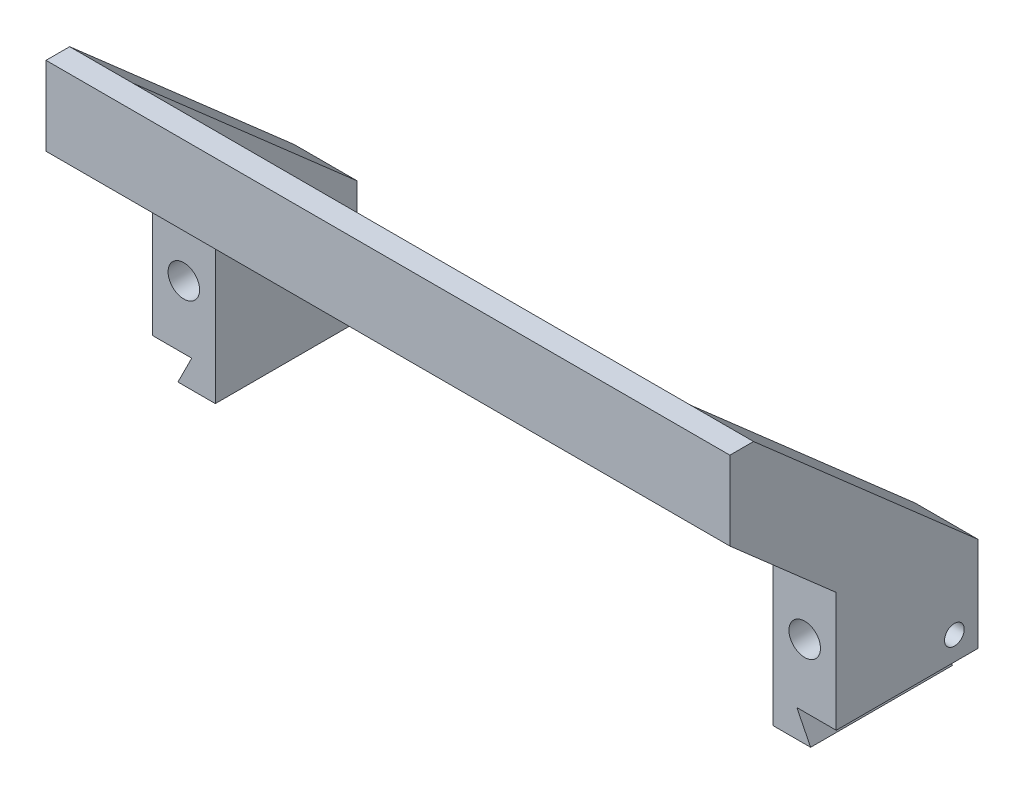
ISO-10303-21;
HEADER;
FILE_DESCRIPTION(('STEP AP214'),'2;1');
FILE_NAME('part.step','',(''),(''),'','','');
FILE_SCHEMA(('AUTOMOTIVE_DESIGN { 1 0 10303 214 1 1 1 1 }'));
ENDSEC;
DATA;
#1=APPLICATION_CONTEXT('core data for automotive mechanical design processes');
#2=APPLICATION_PROTOCOL_DEFINITION('international standard','automotive_design',2000,#1);
#3=PRODUCT_CONTEXT('',#1,'mechanical');
#4=PRODUCT('Part','Part','',(#3));
#5=PRODUCT_RELATED_PRODUCT_CATEGORY('part','',(#4));
#6=PRODUCT_DEFINITION_FORMATION('','',#4);
#7=PRODUCT_DEFINITION_CONTEXT('part definition',#1,'design');
#8=PRODUCT_DEFINITION('design','',#6,#7);
#9=PRODUCT_DEFINITION_SHAPE('','',#8);
#10=(LENGTH_UNIT() NAMED_UNIT(*) SI_UNIT(.MILLI.,.METRE.));
#11=(NAMED_UNIT(*) PLANE_ANGLE_UNIT() SI_UNIT($,.RADIAN.));
#12=(NAMED_UNIT(*) SI_UNIT($,.STERADIAN.) SOLID_ANGLE_UNIT());
#13=UNCERTAINTY_MEASURE_WITH_UNIT(LENGTH_MEASURE(1.E-05),#10,'distance_accuracy_value','');
#14=(GEOMETRIC_REPRESENTATION_CONTEXT(3) GLOBAL_UNCERTAINTY_ASSIGNED_CONTEXT((#13)) GLOBAL_UNIT_ASSIGNED_CONTEXT((#10,
#11,#12)) REPRESENTATION_CONTEXT('',''));
#15=CARTESIAN_POINT('',(0.,0.,0.));
#16=DIRECTION('',(0.,0.,1.));
#17=DIRECTION('',(1.,0.,0.));
#18=AXIS2_PLACEMENT_3D('',#15,#16,#17);
#19=CARTESIAN_POINT('',(-78.83,19.1578947368421,18.));
#20=DIRECTION('',(0.,0.,1.));
#21=DIRECTION('',(0.,-1.,0.));
#22=AXIS2_PLACEMENT_3D('',#19,#20,#21);
#23=PLANE('',#22);
#24=DIRECTION('',(-1.,0.,0.));
#25=VECTOR('',#24,1.);
#26=CARTESIAN_POINT('',(-78.83,0.5,18.));
#27=LINE('',#26,#25);
#28=CARTESIAN_POINT('',(-70.83,0.5,18.));
#29=VERTEX_POINT('',#28);
#30=CARTESIAN_POINT('',(-75.58,0.499999999999995,18.));
#31=VERTEX_POINT('',#30);
#32=EDGE_CURVE('E47',#29,#31,#27,.T.);
#33=ORIENTED_EDGE('',*,*,#32,.F.);
#34=DIRECTION('',(0.,-1.,0.));
#35=VECTOR('',#34,1.);
#36=CARTESIAN_POINT('',(-70.83,19.1578947368421,18.));
#37=LINE('',#36,#35);
#38=CARTESIAN_POINT('',(-70.83,19.1578947368421,18.));
#39=VERTEX_POINT('',#38);
#40=EDGE_CURVE('E171',#39,#29,#37,.T.);
#41=ORIENTED_EDGE('',*,*,#40,.F.);
#42=DIRECTION('',(1.,0.,0.));
#43=VECTOR('',#42,1.);
#44=CARTESIAN_POINT('',(-78.83,19.1578947368421,18.));
#45=LINE('',#44,#43);
#46=CARTESIAN_POINT('',(-78.83,19.1578947368421,18.));
#47=VERTEX_POINT('',#46);
#48=EDGE_CURVE('E196',#47,#39,#45,.T.);
#49=ORIENTED_EDGE('',*,*,#48,.F.);
#50=DIRECTION('',(0.,-1.,0.));
#51=VECTOR('',#50,1.);
#52=CARTESIAN_POINT('',(-78.83,19.1578947368421,18.));
#53=LINE('',#52,#51);
#54=CARTESIAN_POINT('',(-78.83,4.,18.));
#55=VERTEX_POINT('',#54);
#56=EDGE_CURVE('E178',#47,#55,#53,.T.);
#57=ORIENTED_EDGE('',*,*,#56,.T.);
#58=DIRECTION('',(1.,0.,0.));
#59=VECTOR('',#58,1.);
#60=CARTESIAN_POINT('',(-78.83,4.,18.));
#61=LINE('',#60,#59);
#62=CARTESIAN_POINT('',(-73.83,4.,18.));
#63=VERTEX_POINT('',#62);
#64=EDGE_CURVE('E334',#55,#63,#61,.T.);
#65=ORIENTED_EDGE('',*,*,#64,.T.);
#66=DIRECTION('',(-0.447213595499958,-0.894427190999916,0.));
#67=VECTOR('',#66,1.);
#68=CARTESIAN_POINT('',(-68.7668421052632,14.1263157894737,18.));
#69=LINE('',#68,#67);
#70=EDGE_CURVE('E337',#63,#31,#69,.T.);
#71=ORIENTED_EDGE('',*,*,#70,.T.);
#72=EDGE_LOOP('',(#33,#41,#49,#57,#65,#71));
#73=FACE_BOUND('',#72,.T.);
#74=CARTESIAN_POINT('',(-74.83,12.,18.));
#75=DIRECTION('',(0.,0.,1.));
#76=DIRECTION('',(1.,0.,0.));
#77=AXIS2_PLACEMENT_3D('',#74,#75,#76);
#78=CIRCLE('',#77,2.);
#79=CARTESIAN_POINT('',(-72.83,12.,18.));
#80=VERTEX_POINT('',#79);
#81=EDGE_CURVE('E308',#80,#80,#78,.T.);
#82=ORIENTED_EDGE('',*,*,#81,.F.);
#83=EDGE_LOOP('',(#82));
#84=FACE_BOUND('',#83,.T.);
#85=ADVANCED_FACE('F33',(#73,#84),#23,.T.);
#86=CARTESIAN_POINT('',(-78.83,0.,0.));
#87=DIRECTION('',(0.,0.,-1.));
#88=DIRECTION('',(-1.,0.,0.));
#89=AXIS2_PLACEMENT_3D('',#86,#87,#88);
#90=PLANE('',#89);
#91=DIRECTION('',(1.,0.,0.));
#92=VECTOR('',#91,1.);
#93=CARTESIAN_POINT('',(-70.83,0.5,0.));
#94=LINE('',#93,#92);
#95=CARTESIAN_POINT('',(-75.58,0.5,0.));
#96=VERTEX_POINT('',#95);
#97=CARTESIAN_POINT('',(-70.83,0.5,0.));
#98=VERTEX_POINT('',#97);
#99=EDGE_CURVE('E155',#96,#98,#94,.T.);
#100=ORIENTED_EDGE('',*,*,#99,.F.);
#101=DIRECTION('',(0.447213595499958,0.894427190999916,0.));
#102=VECTOR('',#101,1.);
#103=CARTESIAN_POINT('',(-75.83,0.,0.));
#104=LINE('',#103,#102);
#105=CARTESIAN_POINT('',(-73.83,4.,0.));
#106=VERTEX_POINT('',#105);
#107=EDGE_CURVE('E329',#96,#106,#104,.T.);
#108=ORIENTED_EDGE('',*,*,#107,.T.);
#109=DIRECTION('',(-1.,0.,0.));
#110=VECTOR('',#109,1.);
#111=CARTESIAN_POINT('',(-73.83,4.,0.));
#112=LINE('',#111,#110);
#113=CARTESIAN_POINT('',(-78.83,4.,0.));
#114=VERTEX_POINT('',#113);
#115=EDGE_CURVE('E281',#106,#114,#112,.T.);
#116=ORIENTED_EDGE('',*,*,#115,.T.);
#117=DIRECTION('',(0.,1.,0.));
#118=VECTOR('',#117,1.);
#119=CARTESIAN_POINT('',(-78.83,0.,0.));
#120=LINE('',#119,#118);
#121=CARTESIAN_POINT('',(-78.83,16.,0.));
#122=VERTEX_POINT('',#121);
#123=EDGE_CURVE('E190',#114,#122,#120,.T.);
#124=ORIENTED_EDGE('',*,*,#123,.T.);
#125=DIRECTION('',(1.,0.,0.));
#126=VECTOR('',#125,1.);
#127=CARTESIAN_POINT('',(-78.83,16.,0.));
#128=LINE('',#127,#126);
#129=CARTESIAN_POINT('',(-70.83,16.,0.));
#130=VERTEX_POINT('',#129);
#131=EDGE_CURVE('E176',#122,#130,#128,.T.);
#132=ORIENTED_EDGE('',*,*,#131,.T.);
#133=DIRECTION('',(0.,1.,0.));
#134=VECTOR('',#133,1.);
#135=CARTESIAN_POINT('',(-70.83,0.,0.));
#136=LINE('',#135,#134);
#137=EDGE_CURVE('E167',#98,#130,#136,.T.);
#138=ORIENTED_EDGE('',*,*,#137,.F.);
#139=EDGE_LOOP('',(#100,#108,#116,#124,#132,#138));
#140=FACE_BOUND('',#139,.T.);
#141=CARTESIAN_POINT('',(-74.83,12.,0.));
#142=DIRECTION('',(0.,0.,1.));
#143=DIRECTION('',(1.,0.,0.));
#144=AXIS2_PLACEMENT_3D('',#141,#142,#143);
#145=CIRCLE('',#144,2.);
#146=CARTESIAN_POINT('',(-72.83,12.,0.));
#147=VERTEX_POINT('',#146);
#148=EDGE_CURVE('E312',#147,#147,#145,.T.);
#149=ORIENTED_EDGE('',*,*,#148,.T.);
#150=EDGE_LOOP('',(#149));
#151=FACE_BOUND('',#150,.T.);
#152=ADVANCED_FACE('F173',(#140,#151),#90,.T.);
#153=CARTESIAN_POINT('',(-78.83,0.,0.));
#154=DIRECTION('',(-1.,0.,0.));
#155=DIRECTION('',(0.,0.,-1.));
#156=AXIS2_PLACEMENT_3D('',#153,#154,#155);
#157=PLANE('',#156);
#158=CARTESIAN_POINT('',(-78.83,7.,3.));
#159=DIRECTION('',(-1.,0.,0.));
#160=DIRECTION('',(0.,0.,1.));
#161=AXIS2_PLACEMENT_3D('',#158,#159,#160);
#162=CIRCLE('',#161,1.24999999999999);
#163=CARTESIAN_POINT('',(-78.83,7.,4.24999999999999));
#164=VERTEX_POINT('',#163);
#165=EDGE_CURVE('E282',#164,#164,#162,.T.);
#166=ORIENTED_EDGE('',*,*,#165,.F.);
#167=EDGE_LOOP('',(#166));
#168=FACE_BOUND('',#167,.T.);
#169=ORIENTED_EDGE('',*,*,#123,.F.);
#170=DIRECTION('',(0.,0.,1.));
#171=VECTOR('',#170,1.);
#172=CARTESIAN_POINT('',(-78.83,4.,0.));
#173=LINE('',#172,#171);
#174=EDGE_CURVE('E276',#114,#55,#173,.T.);
#175=ORIENTED_EDGE('',*,*,#174,.T.);
#176=ORIENTED_EDGE('',*,*,#56,.F.);
#177=DIRECTION('',(0.,-0.659437818308136,-0.751759112871275));
#178=VECTOR('',#177,1.);
#179=CARTESIAN_POINT('',(-78.83,19.1578947368421,18.));
#180=LINE('',#179,#178);
#181=CARTESIAN_POINT('',(-78.83,31.,31.5));
#182=VERTEX_POINT('',#181);
#183=EDGE_CURVE('E182',#182,#47,#180,.T.);
#184=ORIENTED_EDGE('',*,*,#183,.F.);
#185=DIRECTION('',(0.,-1.,0.));
#186=VECTOR('',#185,1.);
#187=CARTESIAN_POINT('',(-78.83,31.,31.5));
#188=LINE('',#187,#186);
#189=CARTESIAN_POINT('',(-78.83,41.,31.5));
#190=VERTEX_POINT('',#189);
#191=EDGE_CURVE('E342',#190,#182,#188,.T.);
#192=ORIENTED_EDGE('',*,*,#191,.F.);
#193=DIRECTION('',(0.,0.,1.));
#194=VECTOR('',#193,1.);
#195=CARTESIAN_POINT('',(-78.83,41.,31.5));
#196=LINE('',#195,#194);
#197=CARTESIAN_POINT('',(-78.83,41.,28.5));
#198=VERTEX_POINT('',#197);
#199=EDGE_CURVE('E345',#198,#190,#196,.T.);
#200=ORIENTED_EDGE('',*,*,#199,.F.);
#201=DIRECTION('',(0.,0.659437818308136,0.751759112871275));
#202=VECTOR('',#201,1.);
#203=CARTESIAN_POINT('',(-78.83,41.,28.5));
#204=LINE('',#203,#202);
#205=EDGE_CURVE('E348',#122,#198,#204,.T.);
#206=ORIENTED_EDGE('',*,*,#205,.F.);
#207=EDGE_LOOP('',(#169,#175,#176,#184,#192,#200,#206));
#208=FACE_BOUND('',#207,.T.);
#209=ADVANCED_FACE('F370',(#168,#208),#157,.T.);
#210=CARTESIAN_POINT('',(0.,0.,0.));
#211=DIRECTION('',(1.,0.,0.));
#212=DIRECTION('',(0.,0.,-1.));
#213=AXIS2_PLACEMENT_3D('',#210,#211,#212);
#214=PLANE('',#213);
#215=CARTESIAN_POINT('',(0.,7.,3.));
#216=DIRECTION('',(1.,0.,0.));
#217=DIRECTION('',(0.,0.,-1.));
#218=AXIS2_PLACEMENT_3D('',#215,#216,#217);
#219=CIRCLE('',#218,1.24999999999999);
#220=CARTESIAN_POINT('',(0.,7.,1.75000000000001));
#221=VERTEX_POINT('',#220);
#222=EDGE_CURVE('E222',#221,#221,#219,.T.);
#223=ORIENTED_EDGE('',*,*,#222,.T.);
#224=EDGE_LOOP('',(#223));
#225=FACE_BOUND('',#224,.T.);
#226=DIRECTION('',(0.,1.,0.));
#227=VECTOR('',#226,1.);
#228=CARTESIAN_POINT('',(0.,0.,0.));
#229=LINE('',#228,#227);
#230=CARTESIAN_POINT('',(0.,0.5,0.));
#231=VERTEX_POINT('',#230);
#232=CARTESIAN_POINT('',(0.,16.,0.));
#233=VERTEX_POINT('',#232);
#234=EDGE_CURVE('E235',#231,#233,#229,.T.);
#235=ORIENTED_EDGE('',*,*,#234,.F.);
#236=DIRECTION('',(0.,0.,-1.));
#237=VECTOR('',#236,1.);
#238=CARTESIAN_POINT('',(0.,0.5,31.5));
#239=LINE('',#238,#237);
#240=CARTESIAN_POINT('',(0.,0.5,18.));
#241=VERTEX_POINT('',#240);
#242=EDGE_CURVE('E309',#241,#231,#239,.T.);
#243=ORIENTED_EDGE('',*,*,#242,.F.);
#244=DIRECTION('',(0.,-1.,0.));
#245=VECTOR('',#244,1.);
#246=CARTESIAN_POINT('',(0.,19.1578947368421,18.));
#247=LINE('',#246,#245);
#248=CARTESIAN_POINT('',(0.,19.1578947368421,18.));
#249=VERTEX_POINT('',#248);
#250=EDGE_CURVE('E239',#249,#241,#247,.T.);
#251=ORIENTED_EDGE('',*,*,#250,.F.);
#252=DIRECTION('',(0.,-0.659437818308136,-0.751759112871275));
#253=VECTOR('',#252,1.);
#254=CARTESIAN_POINT('',(0.,19.1578947368421,18.));
#255=LINE('',#254,#253);
#256=CARTESIAN_POINT('',(0.,31.,31.5));
#257=VERTEX_POINT('',#256);
#258=EDGE_CURVE('E255',#257,#249,#255,.T.);
#259=ORIENTED_EDGE('',*,*,#258,.F.);
#260=DIRECTION('',(0.,0.,1.));
#261=VECTOR('',#260,1.);
#262=CARTESIAN_POINT('',(0.,31.,28.5));
#263=LINE('',#262,#261);
#264=CARTESIAN_POINT('',(0.,31.,28.5));
#265=VERTEX_POINT('',#264);
#266=EDGE_CURVE('E207',#265,#257,#263,.T.);
#267=ORIENTED_EDGE('',*,*,#266,.F.);
#268=DIRECTION('',(0.,-1.,0.));
#269=VECTOR('',#268,1.);
#270=CARTESIAN_POINT('',(0.,41.,28.5));
#271=LINE('',#270,#269);
#272=CARTESIAN_POINT('',(0.,41.,28.5));
#273=VERTEX_POINT('',#272);
#274=EDGE_CURVE('E204',#273,#265,#271,.T.);
#275=ORIENTED_EDGE('',*,*,#274,.F.);
#276=DIRECTION('',(0.,0.659437818308136,0.751759112871275));
#277=VECTOR('',#276,1.);
#278=CARTESIAN_POINT('',(0.,41.,28.5));
#279=LINE('',#278,#277);
#280=EDGE_CURVE('E252',#233,#273,#279,.T.);
#281=ORIENTED_EDGE('',*,*,#280,.F.);
#282=EDGE_LOOP('',(#235,#243,#251,#259,#267,#275,#281));
#283=FACE_BOUND('',#282,.T.);
#284=ADVANCED_FACE('F394',(#225,#283),#214,.F.);
#285=CARTESIAN_POINT('',(8.,0.,0.));
#286=DIRECTION('',(0.,0.,1.));
#287=DIRECTION('',(1.,0.,0.));
#288=AXIS2_PLACEMENT_3D('',#285,#286,#287);
#289=PLANE('',#288);
#290=CARTESIAN_POINT('',(4.,12.,0.));
#291=DIRECTION('',(0.,0.,1.));
#292=DIRECTION('',(1.,0.,0.));
#293=AXIS2_PLACEMENT_3D('',#290,#291,#292);
#294=CIRCLE('',#293,2.);
#295=CARTESIAN_POINT('',(6.,12.,0.));
#296=VERTEX_POINT('',#295);
#297=EDGE_CURVE('E320',#296,#296,#294,.T.);
#298=ORIENTED_EDGE('',*,*,#297,.T.);
#299=EDGE_LOOP('',(#298));
#300=FACE_BOUND('',#299,.T.);
#301=DIRECTION('',(-0.447213595499958,0.894427190999916,0.));
#302=VECTOR('',#301,1.);
#303=CARTESIAN_POINT('',(5.,0.,0.));
#304=LINE('',#303,#302);
#305=CARTESIAN_POINT('',(4.75,0.5,0.));
#306=VERTEX_POINT('',#305);
#307=CARTESIAN_POINT('',(3.,4.,0.));
#308=VERTEX_POINT('',#307);
#309=EDGE_CURVE('E225',#306,#308,#304,.T.);
#310=ORIENTED_EDGE('',*,*,#309,.F.);
#311=DIRECTION('',(1.,0.,0.));
#312=VECTOR('',#311,1.);
#313=CARTESIAN_POINT('',(0.,0.5,0.));
#314=LINE('',#313,#312);
#315=EDGE_CURVE('E55',#231,#306,#314,.T.);
#316=ORIENTED_EDGE('',*,*,#315,.F.);
#317=ORIENTED_EDGE('',*,*,#234,.T.);
#318=DIRECTION('',(-1.,0.,0.));
#319=VECTOR('',#318,1.);
#320=CARTESIAN_POINT('',(8.,16.,0.));
#321=LINE('',#320,#319);
#322=CARTESIAN_POINT('',(8.,16.,0.));
#323=VERTEX_POINT('',#322);
#324=EDGE_CURVE('E269',#323,#233,#321,.T.);
#325=ORIENTED_EDGE('',*,*,#324,.F.);
#326=DIRECTION('',(0.,1.,0.));
#327=VECTOR('',#326,1.);
#328=CARTESIAN_POINT('',(8.,0.,0.));
#329=LINE('',#328,#327);
#330=CARTESIAN_POINT('',(8.,4.,0.));
#331=VERTEX_POINT('',#330);
#332=EDGE_CURVE('E236',#331,#323,#329,.T.);
#333=ORIENTED_EDGE('',*,*,#332,.F.);
#334=DIRECTION('',(1.,0.,0.));
#335=VECTOR('',#334,1.);
#336=CARTESIAN_POINT('',(3.,4.,0.));
#337=LINE('',#336,#335);
#338=EDGE_CURVE('E227',#308,#331,#337,.T.);
#339=ORIENTED_EDGE('',*,*,#338,.F.);
#340=EDGE_LOOP('',(#310,#316,#317,#325,#333,#339));
#341=FACE_BOUND('',#340,.T.);
#342=ADVANCED_FACE('F35',(#300,#341),#289,.F.);
#343=CARTESIAN_POINT('',(8.,41.,28.5));
#344=DIRECTION('',(0.,-0.751759112871275,0.659437818308136));
#345=DIRECTION('',(0.,-0.659437818308136,-0.751759112871275));
#346=AXIS2_PLACEMENT_3D('',#343,#344,#345);
#347=PLANE('',#346);
#348=ORIENTED_EDGE('',*,*,#280,.T.);
#349=DIRECTION('',(-1.,0.,0.));
#350=VECTOR('',#349,1.);
#351=CARTESIAN_POINT('',(8.,41.,28.5));
#352=LINE('',#351,#350);
#353=CARTESIAN_POINT('',(8.,41.,28.5));
#354=VERTEX_POINT('',#353);
#355=EDGE_CURVE('E266',#354,#273,#352,.T.);
#356=ORIENTED_EDGE('',*,*,#355,.F.);
#357=DIRECTION('',(0.,0.659437818308136,0.751759112871275));
#358=VECTOR('',#357,1.);
#359=CARTESIAN_POINT('',(8.,41.,28.5));
#360=LINE('',#359,#358);
#361=EDGE_CURVE('E238',#323,#354,#360,.T.);
#362=ORIENTED_EDGE('',*,*,#361,.F.);
#363=ORIENTED_EDGE('',*,*,#324,.T.);
#364=EDGE_LOOP('',(#348,#356,#362,#363));
#365=FACE_BOUND('',#364,.T.);
#366=ADVANCED_FACE('F391',(#365),#347,.F.);
#367=CARTESIAN_POINT('',(8.,41.,31.5));
#368=DIRECTION('',(0.,-1.,0.));
#369=DIRECTION('',(0.,0.,-1.));
#370=AXIS2_PLACEMENT_3D('',#367,#368,#369);
#371=PLANE('',#370);
#372=ORIENTED_EDGE('',*,*,#355,.T.);
#373=DIRECTION('',(1.,0.,0.));
#374=VECTOR('',#373,1.);
#375=CARTESIAN_POINT('',(-4.,41.,28.5));
#376=LINE('',#375,#374);
#377=CARTESIAN_POINT('',(-70.83,41.,28.5));
#378=VERTEX_POINT('',#377);
#379=EDGE_CURVE('E210',#378,#273,#376,.T.);
#380=ORIENTED_EDGE('',*,*,#379,.F.);
#381=DIRECTION('',(1.,0.,0.));
#382=VECTOR('',#381,1.);
#383=CARTESIAN_POINT('',(-78.83,41.,28.5));
#384=LINE('',#383,#382);
#385=EDGE_CURVE('E189',#198,#378,#384,.T.);
#386=ORIENTED_EDGE('',*,*,#385,.F.);
#387=ORIENTED_EDGE('',*,*,#199,.T.);
#388=DIRECTION('',(-1.,0.,0.));
#389=VECTOR('',#388,1.);
#390=CARTESIAN_POINT('',(8.,41.,31.5));
#391=LINE('',#390,#389);
#392=CARTESIAN_POINT('',(8.,41.,31.5));
#393=VERTEX_POINT('',#392);
#394=EDGE_CURVE('E264',#393,#190,#391,.T.);
#395=ORIENTED_EDGE('',*,*,#394,.F.);
#396=DIRECTION('',(0.,0.,1.));
#397=VECTOR('',#396,1.);
#398=CARTESIAN_POINT('',(8.,41.,31.5));
#399=LINE('',#398,#397);
#400=EDGE_CURVE('E241',#354,#393,#399,.T.);
#401=ORIENTED_EDGE('',*,*,#400,.F.);
#402=EDGE_LOOP('',(#372,#380,#386,#387,#395,#401));
#403=FACE_BOUND('',#402,.T.);
#404=ADVANCED_FACE('F386',(#403),#371,.F.);
#405=CARTESIAN_POINT('',(8.,31.,31.5));
#406=DIRECTION('',(0.,0.,-1.));
#407=DIRECTION('',(-1.,0.,0.));
#408=AXIS2_PLACEMENT_3D('',#405,#406,#407);
#409=PLANE('',#408);
#410=ORIENTED_EDGE('',*,*,#394,.T.);
#411=ORIENTED_EDGE('',*,*,#191,.T.);
#412=DIRECTION('',(1.,0.,0.));
#413=VECTOR('',#412,1.);
#414=CARTESIAN_POINT('',(-78.83,31.,31.5));
#415=LINE('',#414,#413);
#416=CARTESIAN_POINT('',(-70.83,31.,31.5));
#417=VERTEX_POINT('',#416);
#418=EDGE_CURVE('E193',#182,#417,#415,.T.);
#419=ORIENTED_EDGE('',*,*,#418,.T.);
#420=DIRECTION('',(1.,0.,0.));
#421=VECTOR('',#420,1.);
#422=CARTESIAN_POINT('',(-4.,31.,31.5));
#423=LINE('',#422,#421);
#424=EDGE_CURVE('E213',#417,#257,#423,.T.);
#425=ORIENTED_EDGE('',*,*,#424,.T.);
#426=DIRECTION('',(-1.,0.,0.));
#427=VECTOR('',#426,1.);
#428=CARTESIAN_POINT('',(8.,31.,31.5));
#429=LINE('',#428,#427);
#430=CARTESIAN_POINT('',(8.,31.,31.5));
#431=VERTEX_POINT('',#430);
#432=EDGE_CURVE('E261',#431,#257,#429,.T.);
#433=ORIENTED_EDGE('',*,*,#432,.F.);
#434=DIRECTION('',(0.,-1.,0.));
#435=VECTOR('',#434,1.);
#436=CARTESIAN_POINT('',(8.,31.,31.5));
#437=LINE('',#436,#435);
#438=EDGE_CURVE('E243',#393,#431,#437,.T.);
#439=ORIENTED_EDGE('',*,*,#438,.F.);
#440=EDGE_LOOP('',(#410,#411,#419,#425,#433,#439));
#441=FACE_BOUND('',#440,.T.);
#442=ADVANCED_FACE('F382',(#441),#409,.F.);
#443=CARTESIAN_POINT('',(8.,19.1578947368421,18.));
#444=DIRECTION('',(0.,0.751759112871275,-0.659437818308136));
#445=DIRECTION('',(0.,0.659437818308136,0.751759112871275));
#446=AXIS2_PLACEMENT_3D('',#443,#444,#445);
#447=PLANE('',#446);
#448=ORIENTED_EDGE('',*,*,#258,.T.);
#449=DIRECTION('',(-1.,0.,0.));
#450=VECTOR('',#449,1.);
#451=CARTESIAN_POINT('',(8.,19.1578947368421,18.));
#452=LINE('',#451,#450);
#453=CARTESIAN_POINT('',(8.,19.1578947368421,18.));
#454=VERTEX_POINT('',#453);
#455=EDGE_CURVE('E250',#454,#249,#452,.T.);
#456=ORIENTED_EDGE('',*,*,#455,.F.);
#457=DIRECTION('',(0.,-0.659437818308136,-0.751759112871275));
#458=VECTOR('',#457,1.);
#459=CARTESIAN_POINT('',(8.,19.1578947368421,18.));
#460=LINE('',#459,#458);
#461=EDGE_CURVE('E245',#431,#454,#460,.T.);
#462=ORIENTED_EDGE('',*,*,#461,.F.);
#463=ORIENTED_EDGE('',*,*,#432,.T.);
#464=EDGE_LOOP('',(#448,#456,#462,#463));
#465=FACE_BOUND('',#464,.T.);
#466=ADVANCED_FACE('F396',(#465),#447,.F.);
#467=CARTESIAN_POINT('',(8.,19.1578947368421,18.));
#468=DIRECTION('',(0.,0.,-1.));
#469=DIRECTION('',(0.,1.,0.));
#470=AXIS2_PLACEMENT_3D('',#467,#468,#469);
#471=PLANE('',#470);
#472=CARTESIAN_POINT('',(4.,12.,18.));
#473=DIRECTION('',(0.,0.,1.));
#474=DIRECTION('',(1.,0.,0.));
#475=AXIS2_PLACEMENT_3D('',#472,#473,#474);
#476=CIRCLE('',#475,2.);
#477=CARTESIAN_POINT('',(6.,12.,18.));
#478=VERTEX_POINT('',#477);
#479=EDGE_CURVE('E318',#478,#478,#476,.T.);
#480=ORIENTED_EDGE('',*,*,#479,.F.);
#481=EDGE_LOOP('',(#480));
#482=FACE_BOUND('',#481,.T.);
#483=ORIENTED_EDGE('',*,*,#250,.T.);
#484=DIRECTION('',(1.,0.,0.));
#485=VECTOR('',#484,1.);
#486=CARTESIAN_POINT('',(8.,0.5,18.));
#487=LINE('',#486,#485);
#488=CARTESIAN_POINT('',(4.75,0.499999999999999,18.));
#489=VERTEX_POINT('',#488);
#490=EDGE_CURVE('E306',#241,#489,#487,.T.);
#491=ORIENTED_EDGE('',*,*,#490,.T.);
#492=DIRECTION('',(-0.447213595499958,0.894427190999916,0.));
#493=VECTOR('',#492,1.);
#494=CARTESIAN_POINT('',(-2.06315789473684,14.1263157894737,18.));
#495=LINE('',#494,#493);
#496=CARTESIAN_POINT('',(3.,4.,18.));
#497=VERTEX_POINT('',#496);
#498=EDGE_CURVE('E274',#489,#497,#495,.T.);
#499=ORIENTED_EDGE('',*,*,#498,.T.);
#500=DIRECTION('',(1.,0.,0.));
#501=VECTOR('',#500,1.);
#502=CARTESIAN_POINT('',(8.,4.,18.));
#503=LINE('',#502,#501);
#504=CARTESIAN_POINT('',(8.,4.,18.));
#505=VERTEX_POINT('',#504);
#506=EDGE_CURVE('E232',#497,#505,#503,.T.);
#507=ORIENTED_EDGE('',*,*,#506,.T.);
#508=DIRECTION('',(0.,-1.,0.));
#509=VECTOR('',#508,1.);
#510=CARTESIAN_POINT('',(8.,19.1578947368421,18.));
#511=LINE('',#510,#509);
#512=EDGE_CURVE('E247',#454,#505,#511,.T.);
#513=ORIENTED_EDGE('',*,*,#512,.F.);
#514=ORIENTED_EDGE('',*,*,#455,.T.);
#515=EDGE_LOOP('',(#483,#491,#499,#507,#513,#514));
#516=FACE_BOUND('',#515,.T.);
#517=ADVANCED_FACE('F304',(#482,#516),#471,.F.);
#518=CARTESIAN_POINT('',(8.,0.,0.));
#519=DIRECTION('',(1.,0.,0.));
#520=DIRECTION('',(0.,0.,-1.));
#521=AXIS2_PLACEMENT_3D('',#518,#519,#520);
#522=PLANE('',#521);
#523=CARTESIAN_POINT('',(8.,7.,3.));
#524=DIRECTION('',(1.,0.,0.));
#525=DIRECTION('',(0.,0.,-1.));
#526=AXIS2_PLACEMENT_3D('',#523,#524,#525);
#527=CIRCLE('',#526,1.24999999999999);
#528=CARTESIAN_POINT('',(8.,7.,1.75000000000001));
#529=VERTEX_POINT('',#528);
#530=EDGE_CURVE('E219',#529,#529,#527,.T.);
#531=ORIENTED_EDGE('',*,*,#530,.F.);
#532=EDGE_LOOP('',(#531));
#533=FACE_BOUND('',#532,.T.);
#534=DIRECTION('',(0.,0.,1.));
#535=VECTOR('',#534,1.);
#536=CARTESIAN_POINT('',(8.,4.,0.));
#537=LINE('',#536,#535);
#538=EDGE_CURVE('E272',#331,#505,#537,.T.);
#539=ORIENTED_EDGE('',*,*,#538,.F.);
#540=ORIENTED_EDGE('',*,*,#332,.T.);
#541=ORIENTED_EDGE('',*,*,#361,.T.);
#542=ORIENTED_EDGE('',*,*,#400,.T.);
#543=ORIENTED_EDGE('',*,*,#438,.T.);
#544=ORIENTED_EDGE('',*,*,#461,.T.);
#545=ORIENTED_EDGE('',*,*,#512,.T.);
#546=EDGE_LOOP('',(#539,#540,#541,#542,#543,#544,#545));
#547=FACE_BOUND('',#546,.T.);
#548=ADVANCED_FACE('F299',(#533,#547),#522,.T.);
#549=CARTESIAN_POINT('',(5.,0.,31.5));
#550=DIRECTION('',(-0.894427190999916,-0.447213595499958,0.));
#551=DIRECTION('',(0.447213595499958,-0.894427190999916,0.));
#552=AXIS2_PLACEMENT_3D('',#549,#550,#551);
#553=PLANE('',#552);
#554=ORIENTED_EDGE('',*,*,#498,.F.);
#555=DIRECTION('',(0.,0.,-1.));
#556=VECTOR('',#555,1.);
#557=CARTESIAN_POINT('',(4.75,0.499999999999999,31.5));
#558=LINE('',#557,#556);
#559=EDGE_CURVE('E41',#489,#306,#558,.T.);
#560=ORIENTED_EDGE('',*,*,#559,.T.);
#561=ORIENTED_EDGE('',*,*,#309,.T.);
#562=DIRECTION('',(0.,0.,-1.));
#563=VECTOR('',#562,1.);
#564=CARTESIAN_POINT('',(3.,4.,31.5));
#565=LINE('',#564,#563);
#566=EDGE_CURVE('E229',#497,#308,#565,.T.);
#567=ORIENTED_EDGE('',*,*,#566,.F.);
#568=EDGE_LOOP('',(#554,#560,#561,#567));
#569=FACE_BOUND('',#568,.T.);
#570=ADVANCED_FACE('F286',(#569),#553,.F.);
#571=CARTESIAN_POINT('',(3.,4.,31.5));
#572=DIRECTION('',(0.,1.,0.));
#573=DIRECTION('',(0.,0.,1.));
#574=AXIS2_PLACEMENT_3D('',#571,#572,#573);
#575=PLANE('',#574);
#576=ORIENTED_EDGE('',*,*,#566,.T.);
#577=ORIENTED_EDGE('',*,*,#338,.T.);
#578=ORIENTED_EDGE('',*,*,#538,.T.);
#579=ORIENTED_EDGE('',*,*,#506,.F.);
#580=EDGE_LOOP('',(#576,#577,#578,#579));
#581=FACE_BOUND('',#580,.T.);
#582=ADVANCED_FACE('F296',(#581),#575,.F.);
#583=CARTESIAN_POINT('',(8.,7.,3.));
#584=DIRECTION('',(1.,0.,0.));
#585=DIRECTION('',(0.,0.,-1.));
#586=AXIS2_PLACEMENT_3D('',#583,#584,#585);
#587=CYLINDRICAL_SURFACE('',#586,1.24999999999999);
#588=ORIENTED_EDGE('',*,*,#222,.F.);
#589=EDGE_LOOP('',(#588));
#590=FACE_BOUND('',#589,.T.);
#591=ORIENTED_EDGE('',*,*,#530,.T.);
#592=EDGE_LOOP('',(#591));
#593=FACE_BOUND('',#592,.T.);
#594=ADVANCED_FACE('F419',(#590,#593),#587,.F.);
#595=CARTESIAN_POINT('',(-4.,41.,28.5));
#596=DIRECTION('',(0.,0.,1.));
#597=DIRECTION('',(1.,0.,0.));
#598=AXIS2_PLACEMENT_3D('',#595,#596,#597);
#599=PLANE('',#598);
#600=ORIENTED_EDGE('',*,*,#274,.T.);
#601=DIRECTION('',(1.,0.,0.));
#602=VECTOR('',#601,1.);
#603=CARTESIAN_POINT('',(-4.,31.,28.5));
#604=LINE('',#603,#602);
#605=CARTESIAN_POINT('',(-70.83,31.,28.5));
#606=VERTEX_POINT('',#605);
#607=EDGE_CURVE('E216',#606,#265,#604,.T.);
#608=ORIENTED_EDGE('',*,*,#607,.F.);
#609=DIRECTION('',(0.,-1.,0.));
#610=VECTOR('',#609,1.);
#611=CARTESIAN_POINT('',(-70.83,41.,28.5));
#612=LINE('',#611,#610);
#613=EDGE_CURVE('E198',#378,#606,#612,.T.);
#614=ORIENTED_EDGE('',*,*,#613,.F.);
#615=ORIENTED_EDGE('',*,*,#379,.T.);
#616=EDGE_LOOP('',(#600,#608,#614,#615));
#617=FACE_BOUND('',#616,.T.);
#618=ADVANCED_FACE('F377',(#617),#599,.F.);
#619=CARTESIAN_POINT('',(-4.,31.,28.5));
#620=DIRECTION('',(0.,1.,0.));
#621=DIRECTION('',(0.,0.,1.));
#622=AXIS2_PLACEMENT_3D('',#619,#620,#621);
#623=PLANE('',#622);
#624=ORIENTED_EDGE('',*,*,#266,.T.);
#625=ORIENTED_EDGE('',*,*,#424,.F.);
#626=DIRECTION('',(0.,0.,1.));
#627=VECTOR('',#626,1.);
#628=CARTESIAN_POINT('',(-70.83,31.,28.5));
#629=LINE('',#628,#627);
#630=EDGE_CURVE('E201',#606,#417,#629,.T.);
#631=ORIENTED_EDGE('',*,*,#630,.F.);
#632=ORIENTED_EDGE('',*,*,#607,.T.);
#633=EDGE_LOOP('',(#624,#625,#631,#632));
#634=FACE_BOUND('',#633,.T.);
#635=ADVANCED_FACE('F379',(#634),#623,.F.);
#636=CARTESIAN_POINT('',(-70.83,0.,0.));
#637=DIRECTION('',(-1.,0.,0.));
#638=DIRECTION('',(0.,0.,-1.));
#639=AXIS2_PLACEMENT_3D('',#636,#637,#638);
#640=PLANE('',#639);
#641=CARTESIAN_POINT('',(-70.83,7.,3.));
#642=DIRECTION('',(-1.,0.,0.));
#643=DIRECTION('',(0.,0.,1.));
#644=AXIS2_PLACEMENT_3D('',#641,#642,#643);
#645=CIRCLE('',#644,1.24999999999998);
#646=CARTESIAN_POINT('',(-70.83,7.,4.24999999999998));
#647=VERTEX_POINT('',#646);
#648=EDGE_CURVE('E279',#647,#647,#645,.T.);
#649=ORIENTED_EDGE('',*,*,#648,.T.);
#650=EDGE_LOOP('',(#649));
#651=FACE_BOUND('',#650,.T.);
#652=ORIENTED_EDGE('',*,*,#40,.T.);
#653=DIRECTION('',(0.,0.,-1.));
#654=VECTOR('',#653,1.);
#655=CARTESIAN_POINT('',(-70.83,0.5,31.5));
#656=LINE('',#655,#654);
#657=EDGE_CURVE('E158',#29,#98,#656,.T.);
#658=ORIENTED_EDGE('',*,*,#657,.T.);
#659=ORIENTED_EDGE('',*,*,#137,.T.);
#660=DIRECTION('',(0.,0.659437818308136,0.751759112871275));
#661=VECTOR('',#660,1.);
#662=CARTESIAN_POINT('',(-70.83,41.,28.5));
#663=LINE('',#662,#661);
#664=EDGE_CURVE('E179',#130,#378,#663,.T.);
#665=ORIENTED_EDGE('',*,*,#664,.T.);
#666=ORIENTED_EDGE('',*,*,#613,.T.);
#667=ORIENTED_EDGE('',*,*,#630,.T.);
#668=DIRECTION('',(0.,-0.659437818308136,-0.751759112871275));
#669=VECTOR('',#668,1.);
#670=CARTESIAN_POINT('',(-70.83,19.1578947368421,18.));
#671=LINE('',#670,#669);
#672=EDGE_CURVE('E184',#417,#39,#671,.T.);
#673=ORIENTED_EDGE('',*,*,#672,.T.);
#674=EDGE_LOOP('',(#652,#658,#659,#665,#666,#667,#673));
#675=FACE_BOUND('',#674,.T.);
#676=ADVANCED_FACE('F165',(#651,#675),#640,.F.);
#677=CARTESIAN_POINT('',(-78.83,19.1578947368421,18.));
#678=DIRECTION('',(0.,-0.751759112871275,0.659437818308136));
#679=DIRECTION('',(0.,-0.659437818308136,-0.751759112871275));
#680=AXIS2_PLACEMENT_3D('',#677,#678,#679);
#681=PLANE('',#680);
#682=ORIENTED_EDGE('',*,*,#672,.F.);
#683=ORIENTED_EDGE('',*,*,#418,.F.);
#684=ORIENTED_EDGE('',*,*,#183,.T.);
#685=ORIENTED_EDGE('',*,*,#48,.T.);
#686=EDGE_LOOP('',(#682,#683,#684,#685));
#687=FACE_BOUND('',#686,.T.);
#688=ADVANCED_FACE('F355',(#687),#681,.T.);
#689=CARTESIAN_POINT('',(-78.83,41.,28.5));
#690=DIRECTION('',(0.,0.751759112871275,-0.659437818308136));
#691=DIRECTION('',(0.,0.659437818308136,0.751759112871275));
#692=AXIS2_PLACEMENT_3D('',#689,#690,#691);
#693=PLANE('',#692);
#694=ORIENTED_EDGE('',*,*,#664,.F.);
#695=ORIENTED_EDGE('',*,*,#131,.F.);
#696=ORIENTED_EDGE('',*,*,#205,.T.);
#697=ORIENTED_EDGE('',*,*,#385,.T.);
#698=EDGE_LOOP('',(#694,#695,#696,#697));
#699=FACE_BOUND('',#698,.T.);
#700=ADVANCED_FACE('F374',(#699),#693,.T.);
#701=CARTESIAN_POINT('',(-75.83,0.,31.5));
#702=DIRECTION('',(-0.894427190999916,0.447213595499958,0.));
#703=DIRECTION('',(-0.447213595499958,-0.894427190999916,0.));
#704=AXIS2_PLACEMENT_3D('',#701,#702,#703);
#705=PLANE('',#704);
#706=DIRECTION('',(0.,0.,-1.));
#707=VECTOR('',#706,1.);
#708=CARTESIAN_POINT('',(-75.58,0.5,31.5));
#709=LINE('',#708,#707);
#710=EDGE_CURVE('E11',#31,#96,#709,.T.);
#711=ORIENTED_EDGE('',*,*,#710,.F.);
#712=ORIENTED_EDGE('',*,*,#70,.F.);
#713=DIRECTION('',(0.,0.,-1.));
#714=VECTOR('',#713,1.);
#715=CARTESIAN_POINT('',(-73.83,4.,31.5));
#716=LINE('',#715,#714);
#717=EDGE_CURVE('E331',#63,#106,#716,.T.);
#718=ORIENTED_EDGE('',*,*,#717,.T.);
#719=ORIENTED_EDGE('',*,*,#107,.F.);
#720=EDGE_LOOP('',(#711,#712,#718,#719));
#721=FACE_BOUND('',#720,.T.);
#722=ADVANCED_FACE('F363',(#721),#705,.T.);
#723=CARTESIAN_POINT('',(-73.83,4.,31.5));
#724=DIRECTION('',(0.,-1.,0.));
#725=DIRECTION('',(0.,0.,-1.));
#726=AXIS2_PLACEMENT_3D('',#723,#724,#725);
#727=PLANE('',#726);
#728=ORIENTED_EDGE('',*,*,#174,.F.);
#729=ORIENTED_EDGE('',*,*,#115,.F.);
#730=ORIENTED_EDGE('',*,*,#717,.F.);
#731=ORIENTED_EDGE('',*,*,#64,.F.);
#732=EDGE_LOOP('',(#728,#729,#730,#731));
#733=FACE_BOUND('',#732,.T.);
#734=ADVANCED_FACE('F366',(#733),#727,.T.);
#735=CARTESIAN_POINT('',(-78.83,7.,3.));
#736=DIRECTION('',(-1.,0.,0.));
#737=DIRECTION('',(0.,0.,1.));
#738=AXIS2_PLACEMENT_3D('',#735,#736,#737);
#739=CYLINDRICAL_SURFACE('',#738,1.24999999999998);
#740=ORIENTED_EDGE('',*,*,#165,.T.);
#741=EDGE_LOOP('',(#740));
#742=FACE_BOUND('',#741,.T.);
#743=ORIENTED_EDGE('',*,*,#648,.F.);
#744=EDGE_LOOP('',(#743));
#745=FACE_BOUND('',#744,.T.);
#746=ADVANCED_FACE('F531',(#742,#745),#739,.F.);
#747=CARTESIAN_POINT('',(4.,12.,0.));
#748=DIRECTION('',(0.,0.,1.));
#749=DIRECTION('',(1.,0.,0.));
#750=AXIS2_PLACEMENT_3D('',#747,#748,#749);
#751=CYLINDRICAL_SURFACE('',#750,2.);
#752=ORIENTED_EDGE('',*,*,#297,.F.);
#753=EDGE_LOOP('',(#752));
#754=FACE_BOUND('',#753,.T.);
#755=ORIENTED_EDGE('',*,*,#479,.T.);
#756=EDGE_LOOP('',(#755));
#757=FACE_BOUND('',#756,.T.);
#758=ADVANCED_FACE('F519',(#754,#757),#751,.F.);
#759=CARTESIAN_POINT('',(-74.83,12.,0.));
#760=DIRECTION('',(0.,0.,1.));
#761=DIRECTION('',(1.,0.,0.));
#762=AXIS2_PLACEMENT_3D('',#759,#760,#761);
#763=CYLINDRICAL_SURFACE('',#762,2.);
#764=ORIENTED_EDGE('',*,*,#148,.F.);
#765=EDGE_LOOP('',(#764));
#766=FACE_BOUND('',#765,.T.);
#767=ORIENTED_EDGE('',*,*,#81,.T.);
#768=EDGE_LOOP('',(#767));
#769=FACE_BOUND('',#768,.T.);
#770=ADVANCED_FACE('F513',(#766,#769),#763,.F.);
#771=CARTESIAN_POINT('',(0.,0.5,31.5));
#772=DIRECTION('',(0.,1.,0.));
#773=DIRECTION('',(-1.,0.,0.));
#774=AXIS2_PLACEMENT_3D('',#771,#772,#773);
#775=PLANE('',#774);
#776=ORIENTED_EDGE('',*,*,#242,.T.);
#777=ORIENTED_EDGE('',*,*,#315,.T.);
#778=ORIENTED_EDGE('',*,*,#559,.F.);
#779=ORIENTED_EDGE('',*,*,#490,.F.);
#780=EDGE_LOOP('',(#776,#777,#778,#779));
#781=FACE_BOUND('',#780,.T.);
#782=ADVANCED_FACE('F518',(#781),#775,.F.);
#783=CARTESIAN_POINT('',(-70.83,0.5,31.5));
#784=DIRECTION('',(0.,1.,0.));
#785=DIRECTION('',(0.,0.,1.));
#786=AXIS2_PLACEMENT_3D('',#783,#784,#785);
#787=PLANE('',#786);
#788=ORIENTED_EDGE('',*,*,#32,.T.);
#789=ORIENTED_EDGE('',*,*,#710,.T.);
#790=ORIENTED_EDGE('',*,*,#99,.T.);
#791=ORIENTED_EDGE('',*,*,#657,.F.);
#792=EDGE_LOOP('',(#788,#789,#790,#791));
#793=FACE_BOUND('',#792,.T.);
#794=ADVANCED_FACE('F157',(#793),#787,.F.);
#795=CLOSED_SHELL('',(#85,#152,#209,#284,#342,#366,#404,#442,#466,#517,#548,#570,#582,#594,#618,
#635,#676,#688,#700,#722,#734,#746,#758,#770,#782,#794));
#796=MANIFOLD_SOLID_BREP('B2',#795);
#797=ADVANCED_BREP_SHAPE_REPRESENTATION('',(#18,#796),#14);
#798=SHAPE_DEFINITION_REPRESENTATION(#9,#797);
ENDSEC;
END-ISO-10303-21;
